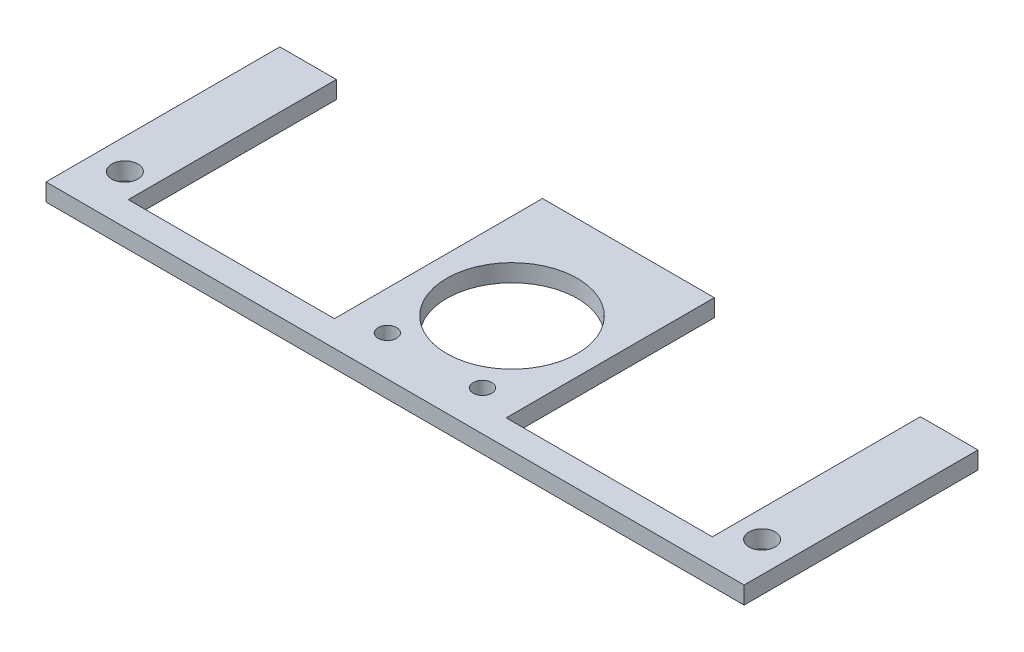
ISO-10303-21;
HEADER;
FILE_DESCRIPTION(('STEP AP214'),'2;1');
FILE_NAME('part.step','',(''),(''),'','','');
FILE_SCHEMA(('AUTOMOTIVE_DESIGN { 1 0 10303 214 1 1 1 1 }'));
ENDSEC;
DATA;
#1=APPLICATION_CONTEXT('core data for automotive mechanical design processes');
#2=APPLICATION_PROTOCOL_DEFINITION('international standard','automotive_design',2000,#1);
#3=PRODUCT_CONTEXT('',#1,'mechanical');
#4=PRODUCT('Part','Part','',(#3));
#5=PRODUCT_RELATED_PRODUCT_CATEGORY('part','',(#4));
#6=PRODUCT_DEFINITION_FORMATION('','',#4);
#7=PRODUCT_DEFINITION_CONTEXT('part definition',#1,'design');
#8=PRODUCT_DEFINITION('design','',#6,#7);
#9=PRODUCT_DEFINITION_SHAPE('','',#8);
#10=(LENGTH_UNIT() NAMED_UNIT(*) SI_UNIT(.MILLI.,.METRE.));
#11=(NAMED_UNIT(*) PLANE_ANGLE_UNIT() SI_UNIT($,.RADIAN.));
#12=(NAMED_UNIT(*) SI_UNIT($,.STERADIAN.) SOLID_ANGLE_UNIT());
#13=UNCERTAINTY_MEASURE_WITH_UNIT(LENGTH_MEASURE(1.E-05),#10,'distance_accuracy_value','');
#14=(GEOMETRIC_REPRESENTATION_CONTEXT(3) GLOBAL_UNCERTAINTY_ASSIGNED_CONTEXT((#13)) GLOBAL_UNIT_ASSIGNED_CONTEXT((#10,
#11,#12)) REPRESENTATION_CONTEXT('',''));
#15=CARTESIAN_POINT('',(0.,0.,0.));
#16=DIRECTION('',(0.,0.,1.));
#17=DIRECTION('',(1.,0.,0.));
#18=AXIS2_PLACEMENT_3D('',#15,#16,#17);
#19=CARTESIAN_POINT('',(0.,2.54,-34.036));
#20=DIRECTION('',(0.,0.,1.));
#21=DIRECTION('',(1.,0.,0.));
#22=AXIS2_PLACEMENT_3D('',#19,#20,#21);
#23=PLANE('',#22);
#24=DIRECTION('',(0.,1.,0.));
#25=VECTOR('',#24,1.);
#26=CARTESIAN_POINT('',(93.2201919535707,0.,-34.036));
#27=LINE('',#26,#25);
#28=CARTESIAN_POINT('',(93.2201919535707,0.,-34.036));
#29=VERTEX_POINT('',#28);
#30=CARTESIAN_POINT('',(93.2201919535707,2.54,-34.036));
#31=VERTEX_POINT('',#30);
#32=EDGE_CURVE('E200',#29,#31,#27,.T.);
#33=ORIENTED_EDGE('',*,*,#32,.T.);
#34=DIRECTION('',(-1.,0.,0.));
#35=VECTOR('',#34,1.);
#36=CARTESIAN_POINT('',(0.,2.54,-34.036));
#37=LINE('',#36,#35);
#38=CARTESIAN_POINT('',(101.6,2.54,-34.036));
#39=VERTEX_POINT('',#38);
#40=EDGE_CURVE('E157',#39,#31,#37,.T.);
#41=ORIENTED_EDGE('',*,*,#40,.F.);
#42=DIRECTION('',(0.,-1.,0.));
#43=VECTOR('',#42,1.);
#44=CARTESIAN_POINT('',(101.6,2.54,-34.036));
#45=LINE('',#44,#43);
#46=CARTESIAN_POINT('',(101.6,0.,-34.036));
#47=VERTEX_POINT('',#46);
#48=EDGE_CURVE('E156',#39,#47,#45,.T.);
#49=ORIENTED_EDGE('',*,*,#48,.T.);
#50=DIRECTION('',(-1.,0.,0.));
#51=VECTOR('',#50,1.);
#52=CARTESIAN_POINT('',(0.,0.,-34.036));
#53=LINE('',#52,#51);
#54=EDGE_CURVE('E144',#47,#29,#53,.T.);
#55=ORIENTED_EDGE('',*,*,#54,.T.);
#56=EDGE_LOOP('',(#33,#41,#49,#55));
#57=FACE_BOUND('',#56,.T.);
#58=ADVANCED_FACE('F33',(#57),#23,.F.);
#59=CARTESIAN_POINT('',(0.,2.54,0.));
#60=DIRECTION('',(0.,-1.,0.));
#61=DIRECTION('',(0.,0.,-1.));
#62=AXIS2_PLACEMENT_3D('',#59,#60,#61);
#63=PLANE('',#62);
#64=CARTESIAN_POINT('',(4.43,2.54,-7.045));
#65=DIRECTION('',(0.,1.,0.));
#66=DIRECTION('',(0.,0.,1.));
#67=AXIS2_PLACEMENT_3D('',#64,#65,#66);
#68=CIRCLE('',#67,1.905);
#69=CARTESIAN_POINT('',(4.43,2.54,-5.14));
#70=VERTEX_POINT('',#69);
#71=EDGE_CURVE('E245',#70,#70,#68,.T.);
#72=ORIENTED_EDGE('',*,*,#71,.F.);
#73=EDGE_LOOP('',(#72));
#74=FACE_BOUND('',#73,.T.);
#75=CARTESIAN_POINT('',(97.17,2.54,-7.045));
#76=DIRECTION('',(0.,1.,0.));
#77=DIRECTION('',(0.,0.,1.));
#78=AXIS2_PLACEMENT_3D('',#75,#76,#77);
#79=CIRCLE('',#78,1.90500000000001);
#80=CARTESIAN_POINT('',(97.17,2.54,-5.13999999999999));
#81=VERTEX_POINT('',#80);
#82=EDGE_CURVE('E239',#81,#81,#79,.T.);
#83=ORIENTED_EDGE('',*,*,#82,.F.);
#84=EDGE_LOOP('',(#83));
#85=FACE_BOUND('',#84,.T.);
#86=CARTESIAN_POINT('',(50.8,2.54,-17.018));
#87=DIRECTION('',(0.,1.,0.));
#88=DIRECTION('',(0.,0.,1.));
#89=AXIS2_PLACEMENT_3D('',#86,#87,#88);
#90=CIRCLE('',#89,9.5);
#91=CARTESIAN_POINT('',(50.8,2.54,-7.51800000000001));
#92=VERTEX_POINT('',#91);
#93=EDGE_CURVE('E233',#92,#92,#90,.T.);
#94=ORIENTED_EDGE('',*,*,#93,.F.);
#95=EDGE_LOOP('',(#94));
#96=FACE_BOUND('',#95,.T.);
#97=CARTESIAN_POINT('',(43.875,2.54,-5.800000084));
#98=DIRECTION('',(0.,1.,0.));
#99=DIRECTION('',(0.,0.,1.));
#100=AXIS2_PLACEMENT_3D('',#97,#98,#99);
#101=CIRCLE('',#100,1.35254999999999);
#102=CARTESIAN_POINT('',(43.875,2.54,-4.44745008400001));
#103=VERTEX_POINT('',#102);
#104=EDGE_CURVE('E229',#103,#103,#101,.T.);
#105=ORIENTED_EDGE('',*,*,#104,.F.);
#106=EDGE_LOOP('',(#105));
#107=FACE_BOUND('',#106,.T.);
#108=CARTESIAN_POINT('',(57.725,2.54,-5.79999999999999));
#109=DIRECTION('',(0.,1.,0.));
#110=DIRECTION('',(0.,0.,1.));
#111=AXIS2_PLACEMENT_3D('',#108,#109,#110);
#112=CIRCLE('',#111,1.35254999999999);
#113=CARTESIAN_POINT('',(57.725,2.54,-4.44745000000001));
#114=VERTEX_POINT('',#113);
#115=EDGE_CURVE('E223',#114,#114,#112,.T.);
#116=ORIENTED_EDGE('',*,*,#115,.F.);
#117=EDGE_LOOP('',(#116));
#118=FACE_BOUND('',#117,.T.);
#119=DIRECTION('',(0.,0.,1.));
#120=VECTOR('',#119,1.);
#121=CARTESIAN_POINT('',(93.2201919535707,2.54,0.));
#122=LINE('',#121,#120);
#123=CARTESIAN_POINT('',(93.2201919535707,2.54,-3.75));
#124=VERTEX_POINT('',#123);
#125=EDGE_CURVE('E129',#31,#124,#122,.T.);
#126=ORIENTED_EDGE('',*,*,#125,.T.);
#127=DIRECTION('',(-1.,0.,0.));
#128=VECTOR('',#127,1.);
#129=CARTESIAN_POINT('',(55.,2.54,-3.75));
#130=LINE('',#129,#128);
#131=CARTESIAN_POINT('',(63.2201920095707,2.54,-3.75));
#132=VERTEX_POINT('',#131);
#133=EDGE_CURVE('E213',#124,#132,#130,.T.);
#134=ORIENTED_EDGE('',*,*,#133,.T.);
#135=DIRECTION('',(0.,0.,1.));
#136=VECTOR('',#135,1.);
#137=CARTESIAN_POINT('',(63.2201920095707,2.54,0.));
#138=LINE('',#137,#136);
#139=CARTESIAN_POINT('',(63.2201920095707,2.54,-34.036));
#140=VERTEX_POINT('',#139);
#141=EDGE_CURVE('E216',#140,#132,#138,.T.);
#142=ORIENTED_EDGE('',*,*,#141,.F.);
#143=CARTESIAN_POINT('',(38.2201919535707,2.54,-34.036));
#144=VERTEX_POINT('',#143);
#145=EDGE_CURVE('E137',#140,#144,#37,.T.);
#146=ORIENTED_EDGE('',*,*,#145,.T.);
#147=DIRECTION('',(0.,0.,1.));
#148=VECTOR('',#147,1.);
#149=CARTESIAN_POINT('',(38.2201919535707,2.54,0.));
#150=LINE('',#149,#148);
#151=CARTESIAN_POINT('',(38.2201919535707,2.54,-3.75));
#152=VERTEX_POINT('',#151);
#153=EDGE_CURVE('E191',#144,#152,#150,.T.);
#154=ORIENTED_EDGE('',*,*,#153,.T.);
#155=DIRECTION('',(-1.,0.,0.));
#156=VECTOR('',#155,1.);
#157=CARTESIAN_POINT('',(0.,2.54,-3.75));
#158=LINE('',#157,#156);
#159=CARTESIAN_POINT('',(8.22019200957067,2.54,-3.75));
#160=VERTEX_POINT('',#159);
#161=EDGE_CURVE('E195',#152,#160,#158,.T.);
#162=ORIENTED_EDGE('',*,*,#161,.T.);
#163=DIRECTION('',(0.,0.,1.));
#164=VECTOR('',#163,1.);
#165=CARTESIAN_POINT('',(8.22019200957067,2.54,0.));
#166=LINE('',#165,#164);
#167=CARTESIAN_POINT('',(8.22019200957067,2.54,-34.036));
#168=VERTEX_POINT('',#167);
#169=EDGE_CURVE('E198',#168,#160,#166,.T.);
#170=ORIENTED_EDGE('',*,*,#169,.F.);
#171=CARTESIAN_POINT('',(0.,2.54,-34.036));
#172=VERTEX_POINT('',#171);
#173=EDGE_CURVE('E179',#168,#172,#37,.T.);
#174=ORIENTED_EDGE('',*,*,#173,.T.);
#175=DIRECTION('',(0.,0.,1.));
#176=VECTOR('',#175,1.);
#177=CARTESIAN_POINT('',(0.,2.54,0.));
#178=LINE('',#177,#176);
#179=CARTESIAN_POINT('',(0.,2.54,0.));
#180=VERTEX_POINT('',#179);
#181=EDGE_CURVE('E148',#172,#180,#178,.T.);
#182=ORIENTED_EDGE('',*,*,#181,.T.);
#183=DIRECTION('',(1.,0.,0.));
#184=VECTOR('',#183,1.);
#185=CARTESIAN_POINT('',(0.,2.54,0.));
#186=LINE('',#185,#184);
#187=CARTESIAN_POINT('',(101.6,2.54,0.));
#188=VERTEX_POINT('',#187);
#189=EDGE_CURVE('E181',#180,#188,#186,.T.);
#190=ORIENTED_EDGE('',*,*,#189,.T.);
#191=DIRECTION('',(0.,0.,-1.));
#192=VECTOR('',#191,1.);
#193=CARTESIAN_POINT('',(101.6,2.54,0.));
#194=LINE('',#193,#192);
#195=EDGE_CURVE('E166',#188,#39,#194,.T.);
#196=ORIENTED_EDGE('',*,*,#195,.T.);
#197=ORIENTED_EDGE('',*,*,#40,.T.);
#198=EDGE_LOOP('',(#126,#134,#142,#146,#154,#162,#170,#174,#182,#190,#196,#197));
#199=FACE_BOUND('',#198,.T.);
#200=ADVANCED_FACE('F260',(#74,#85,#96,#107,#118,#199),#63,.F.);
#201=CARTESIAN_POINT('',(0.,0.,0.));
#202=DIRECTION('',(0.,-1.,0.));
#203=DIRECTION('',(0.,0.,-1.));
#204=AXIS2_PLACEMENT_3D('',#201,#202,#203);
#205=PLANE('',#204);
#206=CARTESIAN_POINT('',(4.43,0.,-7.045));
#207=DIRECTION('',(0.,1.,0.));
#208=DIRECTION('',(0.,0.,1.));
#209=AXIS2_PLACEMENT_3D('',#206,#207,#208);
#210=CIRCLE('',#209,1.905);
#211=CARTESIAN_POINT('',(4.43,0.,-5.14));
#212=VERTEX_POINT('',#211);
#213=EDGE_CURVE('E236',#212,#212,#210,.T.);
#214=ORIENTED_EDGE('',*,*,#213,.T.);
#215=EDGE_LOOP('',(#214));
#216=FACE_BOUND('',#215,.T.);
#217=CARTESIAN_POINT('',(97.17,0.,-7.045));
#218=DIRECTION('',(0.,1.,0.));
#219=DIRECTION('',(0.,0.,1.));
#220=AXIS2_PLACEMENT_3D('',#217,#218,#219);
#221=CIRCLE('',#220,1.90500000000001);
#222=CARTESIAN_POINT('',(97.17,0.,-5.13999999999999));
#223=VERTEX_POINT('',#222);
#224=EDGE_CURVE('E242',#223,#223,#221,.T.);
#225=ORIENTED_EDGE('',*,*,#224,.T.);
#226=EDGE_LOOP('',(#225));
#227=FACE_BOUND('',#226,.T.);
#228=CARTESIAN_POINT('',(50.8,0.,-17.018));
#229=DIRECTION('',(0.,1.,0.));
#230=DIRECTION('',(0.,0.,1.));
#231=AXIS2_PLACEMENT_3D('',#228,#229,#230);
#232=CIRCLE('',#231,9.5);
#233=CARTESIAN_POINT('',(50.8,0.,-7.51800000000001));
#234=VERTEX_POINT('',#233);
#235=EDGE_CURVE('E232',#234,#234,#232,.T.);
#236=ORIENTED_EDGE('',*,*,#235,.T.);
#237=EDGE_LOOP('',(#236));
#238=FACE_BOUND('',#237,.T.);
#239=CARTESIAN_POINT('',(43.875,0.,-5.800000084));
#240=DIRECTION('',(0.,1.,0.));
#241=DIRECTION('',(0.,0.,1.));
#242=AXIS2_PLACEMENT_3D('',#239,#240,#241);
#243=CIRCLE('',#242,1.35255);
#244=CARTESIAN_POINT('',(43.875,0.,-4.447450084));
#245=VERTEX_POINT('',#244);
#246=EDGE_CURVE('E226',#245,#245,#243,.T.);
#247=ORIENTED_EDGE('',*,*,#246,.T.);
#248=EDGE_LOOP('',(#247));
#249=FACE_BOUND('',#248,.T.);
#250=CARTESIAN_POINT('',(57.725,0.,-5.79999999999999));
#251=DIRECTION('',(0.,1.,0.));
#252=DIRECTION('',(0.,0.,1.));
#253=AXIS2_PLACEMENT_3D('',#250,#251,#252);
#254=CIRCLE('',#253,1.35255);
#255=CARTESIAN_POINT('',(57.725,0.,-4.44744999999999));
#256=VERTEX_POINT('',#255);
#257=EDGE_CURVE('E218',#256,#256,#254,.T.);
#258=ORIENTED_EDGE('',*,*,#257,.T.);
#259=EDGE_LOOP('',(#258));
#260=FACE_BOUND('',#259,.T.);
#261=DIRECTION('',(-1.,0.,0.));
#262=VECTOR('',#261,1.);
#263=CARTESIAN_POINT('',(55.,0.,-3.75));
#264=LINE('',#263,#262);
#265=CARTESIAN_POINT('',(93.2201919535707,0.,-3.75));
#266=VERTEX_POINT('',#265);
#267=CARTESIAN_POINT('',(63.2201920095707,0.,-3.75));
#268=VERTEX_POINT('',#267);
#269=EDGE_CURVE('E128',#266,#268,#264,.T.);
#270=ORIENTED_EDGE('',*,*,#269,.F.);
#271=DIRECTION('',(0.,0.,1.));
#272=VECTOR('',#271,1.);
#273=CARTESIAN_POINT('',(93.2201919535707,0.,0.));
#274=LINE('',#273,#272);
#275=EDGE_CURVE('E138',#29,#266,#274,.T.);
#276=ORIENTED_EDGE('',*,*,#275,.F.);
#277=ORIENTED_EDGE('',*,*,#54,.F.);
#278=DIRECTION('',(0.,0.,-1.));
#279=VECTOR('',#278,1.);
#280=CARTESIAN_POINT('',(101.6,0.,0.));
#281=LINE('',#280,#279);
#282=CARTESIAN_POINT('',(101.6,0.,0.));
#283=VERTEX_POINT('',#282);
#284=EDGE_CURVE('E149',#283,#47,#281,.T.);
#285=ORIENTED_EDGE('',*,*,#284,.F.);
#286=DIRECTION('',(1.,0.,0.));
#287=VECTOR('',#286,1.);
#288=CARTESIAN_POINT('',(0.,0.,0.));
#289=LINE('',#288,#287);
#290=CARTESIAN_POINT('',(0.,0.,0.));
#291=VERTEX_POINT('',#290);
#292=EDGE_CURVE('E170',#291,#283,#289,.T.);
#293=ORIENTED_EDGE('',*,*,#292,.F.);
#294=DIRECTION('',(0.,0.,1.));
#295=VECTOR('',#294,1.);
#296=CARTESIAN_POINT('',(0.,0.,0.));
#297=LINE('',#296,#295);
#298=CARTESIAN_POINT('',(0.,0.,-34.036));
#299=VERTEX_POINT('',#298);
#300=EDGE_CURVE('E172',#299,#291,#297,.T.);
#301=ORIENTED_EDGE('',*,*,#300,.F.);
#302=CARTESIAN_POINT('',(8.22019200957067,0.,-34.036));
#303=VERTEX_POINT('',#302);
#304=EDGE_CURVE('E145',#303,#299,#53,.T.);
#305=ORIENTED_EDGE('',*,*,#304,.F.);
#306=DIRECTION('',(0.,0.,1.));
#307=VECTOR('',#306,1.);
#308=CARTESIAN_POINT('',(8.22019200957067,0.,0.));
#309=LINE('',#308,#307);
#310=CARTESIAN_POINT('',(8.22019200957067,0.,-3.75));
#311=VERTEX_POINT('',#310);
#312=EDGE_CURVE('E194',#303,#311,#309,.T.);
#313=ORIENTED_EDGE('',*,*,#312,.T.);
#314=DIRECTION('',(-1.,0.,0.));
#315=VECTOR('',#314,1.);
#316=CARTESIAN_POINT('',(0.,0.,-3.75));
#317=LINE('',#316,#315);
#318=CARTESIAN_POINT('',(38.2201919535707,0.,-3.75));
#319=VERTEX_POINT('',#318);
#320=EDGE_CURVE('E202',#319,#311,#317,.T.);
#321=ORIENTED_EDGE('',*,*,#320,.F.);
#322=DIRECTION('',(0.,0.,1.));
#323=VECTOR('',#322,1.);
#324=CARTESIAN_POINT('',(38.2201919535707,0.,0.));
#325=LINE('',#324,#323);
#326=CARTESIAN_POINT('',(38.2201919535707,0.,-34.036));
#327=VERTEX_POINT('',#326);
#328=EDGE_CURVE('E143',#327,#319,#325,.T.);
#329=ORIENTED_EDGE('',*,*,#328,.F.);
#330=CARTESIAN_POINT('',(63.2201920095707,0.,-34.036));
#331=VERTEX_POINT('',#330);
#332=EDGE_CURVE('E135',#331,#327,#53,.T.);
#333=ORIENTED_EDGE('',*,*,#332,.F.);
#334=DIRECTION('',(0.,0.,1.));
#335=VECTOR('',#334,1.);
#336=CARTESIAN_POINT('',(63.2201920095707,0.,0.));
#337=LINE('',#336,#335);
#338=EDGE_CURVE('E120',#331,#268,#337,.T.);
#339=ORIENTED_EDGE('',*,*,#338,.T.);
#340=EDGE_LOOP('',(#270,#276,#277,#285,#293,#301,#305,#313,#321,#329,#333,#339));
#341=FACE_BOUND('',#340,.T.);
#342=ADVANCED_FACE('F141',(#216,#227,#238,#249,#260,#341),#205,.T.);
#343=ORIENTED_EDGE('',*,*,#145,.F.);
#344=DIRECTION('',(0.,1.,0.));
#345=VECTOR('',#344,1.);
#346=CARTESIAN_POINT('',(63.2201920095707,0.,-34.036));
#347=LINE('',#346,#345);
#348=EDGE_CURVE('E123',#331,#140,#347,.T.);
#349=ORIENTED_EDGE('',*,*,#348,.F.);
#350=ORIENTED_EDGE('',*,*,#332,.T.);
#351=DIRECTION('',(0.,1.,0.));
#352=VECTOR('',#351,1.);
#353=CARTESIAN_POINT('',(38.2201919535707,0.,-34.036));
#354=LINE('',#353,#352);
#355=EDGE_CURVE('E174',#327,#144,#354,.T.);
#356=ORIENTED_EDGE('',*,*,#355,.T.);
#357=EDGE_LOOP('',(#343,#349,#350,#356));
#358=FACE_BOUND('',#357,.T.);
#359=ADVANCED_FACE('F133',(#358),#23,.F.);
#360=CARTESIAN_POINT('',(0.,2.54,0.));
#361=DIRECTION('',(1.,0.,0.));
#362=DIRECTION('',(0.,0.,-1.));
#363=AXIS2_PLACEMENT_3D('',#360,#361,#362);
#364=PLANE('',#363);
#365=ORIENTED_EDGE('',*,*,#300,.T.);
#366=DIRECTION('',(0.,-1.,0.));
#367=VECTOR('',#366,1.);
#368=CARTESIAN_POINT('',(0.,2.54,0.));
#369=LINE('',#368,#367);
#370=EDGE_CURVE('E11',#180,#291,#369,.T.);
#371=ORIENTED_EDGE('',*,*,#370,.F.);
#372=ORIENTED_EDGE('',*,*,#181,.F.);
#373=DIRECTION('',(0.,-1.,0.));
#374=VECTOR('',#373,1.);
#375=CARTESIAN_POINT('',(0.,2.54,-34.036));
#376=LINE('',#375,#374);
#377=EDGE_CURVE('E153',#172,#299,#376,.T.);
#378=ORIENTED_EDGE('',*,*,#377,.T.);
#379=EDGE_LOOP('',(#365,#371,#372,#378));
#380=FACE_BOUND('',#379,.T.);
#381=ADVANCED_FACE('F35',(#380),#364,.F.);
#382=CARTESIAN_POINT('',(0.,2.54,0.));
#383=DIRECTION('',(0.,0.,-1.));
#384=DIRECTION('',(-1.,0.,0.));
#385=AXIS2_PLACEMENT_3D('',#382,#383,#384);
#386=PLANE('',#385);
#387=ORIENTED_EDGE('',*,*,#292,.T.);
#388=DIRECTION('',(0.,-1.,0.));
#389=VECTOR('',#388,1.);
#390=CARTESIAN_POINT('',(101.6,2.54,0.));
#391=LINE('',#390,#389);
#392=EDGE_CURVE('E41',#188,#283,#391,.T.);
#393=ORIENTED_EDGE('',*,*,#392,.F.);
#394=ORIENTED_EDGE('',*,*,#189,.F.);
#395=ORIENTED_EDGE('',*,*,#370,.T.);
#396=EDGE_LOOP('',(#387,#393,#394,#395));
#397=FACE_BOUND('',#396,.T.);
#398=ADVANCED_FACE('F296',(#397),#386,.F.);
#399=CARTESIAN_POINT('',(101.6,2.54,0.));
#400=DIRECTION('',(-1.,0.,0.));
#401=DIRECTION('',(0.,0.,1.));
#402=AXIS2_PLACEMENT_3D('',#399,#400,#401);
#403=PLANE('',#402);
#404=ORIENTED_EDGE('',*,*,#284,.T.);
#405=ORIENTED_EDGE('',*,*,#48,.F.);
#406=ORIENTED_EDGE('',*,*,#195,.F.);
#407=ORIENTED_EDGE('',*,*,#392,.T.);
#408=EDGE_LOOP('',(#404,#405,#406,#407));
#409=FACE_BOUND('',#408,.T.);
#410=ADVANCED_FACE('F164',(#409),#403,.F.);
#411=ORIENTED_EDGE('',*,*,#173,.F.);
#412=DIRECTION('',(0.,1.,0.));
#413=VECTOR('',#412,1.);
#414=CARTESIAN_POINT('',(8.22019200957067,0.,-34.036));
#415=LINE('',#414,#413);
#416=EDGE_CURVE('E185',#303,#168,#415,.T.);
#417=ORIENTED_EDGE('',*,*,#416,.F.);
#418=ORIENTED_EDGE('',*,*,#304,.T.);
#419=ORIENTED_EDGE('',*,*,#377,.F.);
#420=EDGE_LOOP('',(#411,#417,#418,#419));
#421=FACE_BOUND('',#420,.T.);
#422=ADVANCED_FACE('F280',(#421),#23,.F.);
#423=CARTESIAN_POINT('',(38.2201919535707,0.,0.));
#424=DIRECTION('',(-1.,0.,0.));
#425=DIRECTION('',(0.,0.,1.));
#426=AXIS2_PLACEMENT_3D('',#423,#424,#425);
#427=PLANE('',#426);
#428=ORIENTED_EDGE('',*,*,#153,.F.);
#429=ORIENTED_EDGE('',*,*,#355,.F.);
#430=ORIENTED_EDGE('',*,*,#328,.T.);
#431=DIRECTION('',(0.,1.,0.));
#432=VECTOR('',#431,1.);
#433=CARTESIAN_POINT('',(38.2201919535707,0.,-3.75));
#434=LINE('',#433,#432);
#435=EDGE_CURVE('E188',#319,#152,#434,.T.);
#436=ORIENTED_EDGE('',*,*,#435,.T.);
#437=EDGE_LOOP('',(#428,#429,#430,#436));
#438=FACE_BOUND('',#437,.T.);
#439=ADVANCED_FACE('F287',(#438),#427,.T.);
#440=CARTESIAN_POINT('',(0.,0.,-3.75));
#441=DIRECTION('',(0.,0.,-1.));
#442=DIRECTION('',(-1.,0.,0.));
#443=AXIS2_PLACEMENT_3D('',#440,#441,#442);
#444=PLANE('',#443);
#445=ORIENTED_EDGE('',*,*,#161,.F.);
#446=ORIENTED_EDGE('',*,*,#435,.F.);
#447=ORIENTED_EDGE('',*,*,#320,.T.);
#448=DIRECTION('',(0.,1.,0.));
#449=VECTOR('',#448,1.);
#450=CARTESIAN_POINT('',(8.22019200957067,0.,-3.75));
#451=LINE('',#450,#449);
#452=EDGE_CURVE('E56',#311,#160,#451,.T.);
#453=ORIENTED_EDGE('',*,*,#452,.T.);
#454=EDGE_LOOP('',(#445,#446,#447,#453));
#455=FACE_BOUND('',#454,.T.);
#456=ADVANCED_FACE('F293',(#455),#444,.T.);
#457=CARTESIAN_POINT('',(8.22019200957067,0.,0.));
#458=DIRECTION('',(-1.,0.,0.));
#459=DIRECTION('',(0.,0.,1.));
#460=AXIS2_PLACEMENT_3D('',#457,#458,#459);
#461=PLANE('',#460);
#462=ORIENTED_EDGE('',*,*,#169,.T.);
#463=ORIENTED_EDGE('',*,*,#452,.F.);
#464=ORIENTED_EDGE('',*,*,#312,.F.);
#465=ORIENTED_EDGE('',*,*,#416,.T.);
#466=EDGE_LOOP('',(#462,#463,#464,#465));
#467=FACE_BOUND('',#466,.T.);
#468=ADVANCED_FACE('F307',(#467),#461,.F.);
#469=CARTESIAN_POINT('',(93.2201919535707,0.,0.));
#470=DIRECTION('',(-1.,0.,0.));
#471=DIRECTION('',(0.,0.,1.));
#472=AXIS2_PLACEMENT_3D('',#469,#470,#471);
#473=PLANE('',#472);
#474=ORIENTED_EDGE('',*,*,#125,.F.);
#475=ORIENTED_EDGE('',*,*,#32,.F.);
#476=ORIENTED_EDGE('',*,*,#275,.T.);
#477=DIRECTION('',(0.,1.,0.));
#478=VECTOR('',#477,1.);
#479=CARTESIAN_POINT('',(93.2201919535707,0.,-3.75));
#480=LINE('',#479,#478);
#481=EDGE_CURVE('E207',#266,#124,#480,.T.);
#482=ORIENTED_EDGE('',*,*,#481,.T.);
#483=EDGE_LOOP('',(#474,#475,#476,#482));
#484=FACE_BOUND('',#483,.T.);
#485=ADVANCED_FACE('F275',(#484),#473,.T.);
#486=CARTESIAN_POINT('',(55.,0.,-3.75));
#487=DIRECTION('',(0.,0.,-1.));
#488=DIRECTION('',(-1.,0.,0.));
#489=AXIS2_PLACEMENT_3D('',#486,#487,#488);
#490=PLANE('',#489);
#491=ORIENTED_EDGE('',*,*,#133,.F.);
#492=ORIENTED_EDGE('',*,*,#481,.F.);
#493=ORIENTED_EDGE('',*,*,#269,.T.);
#494=DIRECTION('',(0.,1.,0.));
#495=VECTOR('',#494,1.);
#496=CARTESIAN_POINT('',(63.2201920095707,0.,-3.75));
#497=LINE('',#496,#495);
#498=EDGE_CURVE('E48',#268,#132,#497,.T.);
#499=ORIENTED_EDGE('',*,*,#498,.T.);
#500=EDGE_LOOP('',(#491,#492,#493,#499));
#501=FACE_BOUND('',#500,.T.);
#502=ADVANCED_FACE('F373',(#501),#490,.T.);
#503=CARTESIAN_POINT('',(63.2201920095707,0.,0.));
#504=DIRECTION('',(-1.,0.,0.));
#505=DIRECTION('',(0.,0.,1.));
#506=AXIS2_PLACEMENT_3D('',#503,#504,#505);
#507=PLANE('',#506);
#508=ORIENTED_EDGE('',*,*,#141,.T.);
#509=ORIENTED_EDGE('',*,*,#498,.F.);
#510=ORIENTED_EDGE('',*,*,#338,.F.);
#511=ORIENTED_EDGE('',*,*,#348,.T.);
#512=EDGE_LOOP('',(#508,#509,#510,#511));
#513=FACE_BOUND('',#512,.T.);
#514=ADVANCED_FACE('F122',(#513),#507,.F.);
#515=CARTESIAN_POINT('',(57.725,2.54,-5.79999999999999));
#516=DIRECTION('',(0.,1.,0.));
#517=DIRECTION('',(0.,0.,1.));
#518=AXIS2_PLACEMENT_3D('',#515,#516,#517);
#519=CYLINDRICAL_SURFACE('',#518,1.35254999999999);
#520=ORIENTED_EDGE('',*,*,#257,.F.);
#521=EDGE_LOOP('',(#520));
#522=FACE_BOUND('',#521,.T.);
#523=ORIENTED_EDGE('',*,*,#115,.T.);
#524=EDGE_LOOP('',(#523));
#525=FACE_BOUND('',#524,.T.);
#526=ADVANCED_FACE('F354',(#522,#525),#519,.F.);
#527=CARTESIAN_POINT('',(43.875,2.54,-5.800000084));
#528=DIRECTION('',(0.,1.,0.));
#529=DIRECTION('',(0.,0.,1.));
#530=AXIS2_PLACEMENT_3D('',#527,#528,#529);
#531=CYLINDRICAL_SURFACE('',#530,1.35254999999999);
#532=ORIENTED_EDGE('',*,*,#246,.F.);
#533=EDGE_LOOP('',(#532));
#534=FACE_BOUND('',#533,.T.);
#535=ORIENTED_EDGE('',*,*,#104,.T.);
#536=EDGE_LOOP('',(#535));
#537=FACE_BOUND('',#536,.T.);
#538=ADVANCED_FACE('F342',(#534,#537),#531,.F.);
#539=CARTESIAN_POINT('',(50.8,0.,-17.018));
#540=DIRECTION('',(0.,1.,0.));
#541=DIRECTION('',(0.,0.,1.));
#542=AXIS2_PLACEMENT_3D('',#539,#540,#541);
#543=CYLINDRICAL_SURFACE('',#542,9.5);
#544=ORIENTED_EDGE('',*,*,#235,.F.);
#545=EDGE_LOOP('',(#544));
#546=FACE_BOUND('',#545,.T.);
#547=ORIENTED_EDGE('',*,*,#93,.T.);
#548=EDGE_LOOP('',(#547));
#549=FACE_BOUND('',#548,.T.);
#550=ADVANCED_FACE('F337',(#546,#549),#543,.F.);
#551=CARTESIAN_POINT('',(97.17,0.,-7.045));
#552=DIRECTION('',(0.,1.,0.));
#553=DIRECTION('',(0.,0.,1.));
#554=AXIS2_PLACEMENT_3D('',#551,#552,#553);
#555=CYLINDRICAL_SURFACE('',#554,1.90500000000001);
#556=ORIENTED_EDGE('',*,*,#224,.F.);
#557=EDGE_LOOP('',(#556));
#558=FACE_BOUND('',#557,.T.);
#559=ORIENTED_EDGE('',*,*,#82,.T.);
#560=EDGE_LOOP('',(#559));
#561=FACE_BOUND('',#560,.T.);
#562=ADVANCED_FACE('F256',(#558,#561),#555,.F.);
#563=CARTESIAN_POINT('',(4.43,0.,-7.045));
#564=DIRECTION('',(0.,1.,0.));
#565=DIRECTION('',(0.,0.,1.));
#566=AXIS2_PLACEMENT_3D('',#563,#564,#565);
#567=CYLINDRICAL_SURFACE('',#566,1.905);
#568=ORIENTED_EDGE('',*,*,#213,.F.);
#569=EDGE_LOOP('',(#568));
#570=FACE_BOUND('',#569,.T.);
#571=ORIENTED_EDGE('',*,*,#71,.T.);
#572=EDGE_LOOP('',(#571));
#573=FACE_BOUND('',#572,.T.);
#574=ADVANCED_FACE('F253',(#570,#573),#567,.F.);
#575=CLOSED_SHELL('',(#58,#200,#342,#359,#381,#398,#410,#422,#439,#456,#468,#485,#502,#514,#526,
#538,#550,#562,#574));
#576=MANIFOLD_SOLID_BREP('B2',#575);
#577=ADVANCED_BREP_SHAPE_REPRESENTATION('',(#18,#576),#14);
#578=SHAPE_DEFINITION_REPRESENTATION(#9,#577);
ENDSEC;
END-ISO-10303-21;
